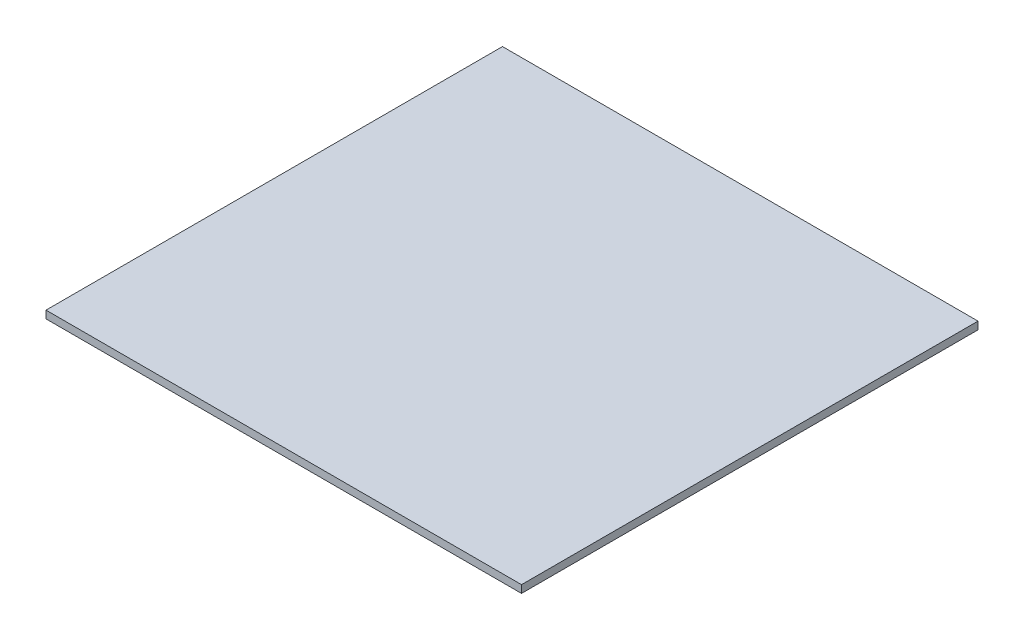
ISO-10303-21;
HEADER;
FILE_DESCRIPTION(('STEP AP214'),'2;1');
FILE_NAME('part.step','',(''),(''),'','','');
FILE_SCHEMA(('AUTOMOTIVE_DESIGN { 1 0 10303 214 1 1 1 1 }'));
ENDSEC;
DATA;
#1=APPLICATION_CONTEXT('core data for automotive mechanical design processes');
#2=APPLICATION_PROTOCOL_DEFINITION('international standard','automotive_design',2000,#1);
#3=PRODUCT_CONTEXT('',#1,'mechanical');
#4=PRODUCT('Part','Part','',(#3));
#5=PRODUCT_RELATED_PRODUCT_CATEGORY('part','',(#4));
#6=PRODUCT_DEFINITION_FORMATION('','',#4);
#7=PRODUCT_DEFINITION_CONTEXT('part definition',#1,'design');
#8=PRODUCT_DEFINITION('design','',#6,#7);
#9=PRODUCT_DEFINITION_SHAPE('','',#8);
#10=(LENGTH_UNIT() NAMED_UNIT(*) SI_UNIT(.MILLI.,.METRE.));
#11=(NAMED_UNIT(*) PLANE_ANGLE_UNIT() SI_UNIT($,.RADIAN.));
#12=(NAMED_UNIT(*) SI_UNIT($,.STERADIAN.) SOLID_ANGLE_UNIT());
#13=UNCERTAINTY_MEASURE_WITH_UNIT(LENGTH_MEASURE(1.E-05),#10,'distance_accuracy_value','');
#14=(GEOMETRIC_REPRESENTATION_CONTEXT(3) GLOBAL_UNCERTAINTY_ASSIGNED_CONTEXT((#13)) GLOBAL_UNIT_ASSIGNED_CONTEXT((#10,
#11,#12)) REPRESENTATION_CONTEXT('',''));
#15=CARTESIAN_POINT('',(0.,0.,0.));
#16=DIRECTION('',(0.,0.,1.));
#17=DIRECTION('',(1.,0.,0.));
#18=AXIS2_PLACEMENT_3D('',#15,#16,#17);
#19=CARTESIAN_POINT('',(-56.25,-2.,-82.3621323529412));
#20=DIRECTION('',(-1.,0.,0.));
#21=DIRECTION('',(0.,0.,1.));
#22=AXIS2_PLACEMENT_3D('',#19,#20,#21);
#23=PLANE('',#22);
#24=DIRECTION('',(0.,0.,1.));
#25=VECTOR('',#24,1.);
#26=CARTESIAN_POINT('',(-56.25,0.,-82.3621323529412));
#27=LINE('',#26,#25);
#28=CARTESIAN_POINT('',(-56.25,0.,-82.3621323529412));
#29=VERTEX_POINT('',#28);
#30=CARTESIAN_POINT('',(-56.25,0.,37.6378676470588));
#31=VERTEX_POINT('',#30);
#32=EDGE_CURVE('E97',#29,#31,#27,.T.);
#33=ORIENTED_EDGE('',*,*,#32,.F.);
#34=DIRECTION('',(0.,1.,0.));
#35=VECTOR('',#34,1.);
#36=CARTESIAN_POINT('',(-56.25,-2.,-82.3621323529412));
#37=LINE('',#36,#35);
#38=CARTESIAN_POINT('',(-56.25,-2.,-82.3621323529412));
#39=VERTEX_POINT('',#38);
#40=EDGE_CURVE('E11',#39,#29,#37,.T.);
#41=ORIENTED_EDGE('',*,*,#40,.F.);
#42=DIRECTION('',(0.,0.,1.));
#43=VECTOR('',#42,1.);
#44=CARTESIAN_POINT('',(-56.25,-2.,-82.3621323529412));
#45=LINE('',#44,#43);
#46=CARTESIAN_POINT('',(-56.25,-2.,37.6378676470588));
#47=VERTEX_POINT('',#46);
#48=EDGE_CURVE('E91',#39,#47,#45,.T.);
#49=ORIENTED_EDGE('',*,*,#48,.T.);
#50=DIRECTION('',(0.,1.,0.));
#51=VECTOR('',#50,1.);
#52=CARTESIAN_POINT('',(-56.25,-2.,37.6378676470588));
#53=LINE('',#52,#51);
#54=EDGE_CURVE('E36',#47,#31,#53,.T.);
#55=ORIENTED_EDGE('',*,*,#54,.T.);
#56=EDGE_LOOP('',(#33,#41,#49,#55));
#57=FACE_BOUND('',#56,.T.);
#58=ADVANCED_FACE('F33',(#57),#23,.T.);
#59=CARTESIAN_POINT('',(-56.25,-2.,-82.3621323529412));
#60=DIRECTION('',(0.,0.,-1.));
#61=DIRECTION('',(-1.,0.,0.));
#62=AXIS2_PLACEMENT_3D('',#59,#60,#61);
#63=PLANE('',#62);
#64=DIRECTION('',(-1.,0.,0.));
#65=VECTOR('',#64,1.);
#66=CARTESIAN_POINT('',(-56.25,0.,-82.3621323529412));
#67=LINE('',#66,#65);
#68=CARTESIAN_POINT('',(68.75,0.,-82.3621323529412));
#69=VERTEX_POINT('',#68);
#70=EDGE_CURVE('E93',#69,#29,#67,.T.);
#71=ORIENTED_EDGE('',*,*,#70,.F.);
#72=DIRECTION('',(0.,1.,0.));
#73=VECTOR('',#72,1.);
#74=CARTESIAN_POINT('',(68.75,-2.,-82.3621323529412));
#75=LINE('',#74,#73);
#76=CARTESIAN_POINT('',(68.75,-2.,-82.3621323529412));
#77=VERTEX_POINT('',#76);
#78=EDGE_CURVE('E42',#77,#69,#75,.T.);
#79=ORIENTED_EDGE('',*,*,#78,.F.);
#80=DIRECTION('',(-1.,0.,0.));
#81=VECTOR('',#80,1.);
#82=CARTESIAN_POINT('',(-56.25,-2.,-82.3621323529412));
#83=LINE('',#82,#81);
#84=EDGE_CURVE('E88',#77,#39,#83,.T.);
#85=ORIENTED_EDGE('',*,*,#84,.T.);
#86=ORIENTED_EDGE('',*,*,#40,.T.);
#87=EDGE_LOOP('',(#71,#79,#85,#86));
#88=FACE_BOUND('',#87,.T.);
#89=ADVANCED_FACE('F107',(#88),#63,.T.);
#90=CARTESIAN_POINT('',(68.75,-2.,-82.3621323529412));
#91=DIRECTION('',(1.,0.,0.));
#92=DIRECTION('',(0.,0.,-1.));
#93=AXIS2_PLACEMENT_3D('',#90,#91,#92);
#94=PLANE('',#93);
#95=DIRECTION('',(0.,0.,-1.));
#96=VECTOR('',#95,1.);
#97=CARTESIAN_POINT('',(68.75,0.,-82.3621323529412));
#98=LINE('',#97,#96);
#99=CARTESIAN_POINT('',(68.75,0.,37.6378676470588));
#100=VERTEX_POINT('',#99);
#101=EDGE_CURVE('E83',#100,#69,#98,.T.);
#102=ORIENTED_EDGE('',*,*,#101,.F.);
#103=DIRECTION('',(0.,1.,0.));
#104=VECTOR('',#103,1.);
#105=CARTESIAN_POINT('',(68.75,-2.,37.6378676470588));
#106=LINE('',#105,#104);
#107=CARTESIAN_POINT('',(68.75,-2.,37.6378676470588));
#108=VERTEX_POINT('',#107);
#109=EDGE_CURVE('E78',#108,#100,#106,.T.);
#110=ORIENTED_EDGE('',*,*,#109,.F.);
#111=DIRECTION('',(0.,0.,-1.));
#112=VECTOR('',#111,1.);
#113=CARTESIAN_POINT('',(68.75,-2.,-82.3621323529412));
#114=LINE('',#113,#112);
#115=EDGE_CURVE('E81',#108,#77,#114,.T.);
#116=ORIENTED_EDGE('',*,*,#115,.T.);
#117=ORIENTED_EDGE('',*,*,#78,.T.);
#118=EDGE_LOOP('',(#102,#110,#116,#117));
#119=FACE_BOUND('',#118,.T.);
#120=ADVANCED_FACE('F80',(#119),#94,.T.);
#121=CARTESIAN_POINT('',(-56.25,-2.,37.6378676470588));
#122=DIRECTION('',(0.,0.,1.));
#123=DIRECTION('',(1.,0.,0.));
#124=AXIS2_PLACEMENT_3D('',#121,#122,#123);
#125=PLANE('',#124);
#126=DIRECTION('',(1.,0.,0.));
#127=VECTOR('',#126,1.);
#128=CARTESIAN_POINT('',(-56.25,0.,37.6378676470588));
#129=LINE('',#128,#127);
#130=EDGE_CURVE('E100',#31,#100,#129,.T.);
#131=ORIENTED_EDGE('',*,*,#130,.F.);
#132=ORIENTED_EDGE('',*,*,#54,.F.);
#133=DIRECTION('',(1.,0.,0.));
#134=VECTOR('',#133,1.);
#135=CARTESIAN_POINT('',(-56.25,-2.,37.6378676470588));
#136=LINE('',#135,#134);
#137=EDGE_CURVE('E87',#47,#108,#136,.T.);
#138=ORIENTED_EDGE('',*,*,#137,.T.);
#139=ORIENTED_EDGE('',*,*,#109,.T.);
#140=EDGE_LOOP('',(#131,#132,#138,#139));
#141=FACE_BOUND('',#140,.T.);
#142=ADVANCED_FACE('F90',(#141),#125,.T.);
#143=CARTESIAN_POINT('',(0.,-2.,0.));
#144=DIRECTION('',(0.,1.,0.));
#145=DIRECTION('',(0.,0.,1.));
#146=AXIS2_PLACEMENT_3D('',#143,#144,#145);
#147=PLANE('',#146);
#148=ORIENTED_EDGE('',*,*,#48,.F.);
#149=ORIENTED_EDGE('',*,*,#84,.F.);
#150=ORIENTED_EDGE('',*,*,#115,.F.);
#151=ORIENTED_EDGE('',*,*,#137,.F.);
#152=EDGE_LOOP('',(#148,#149,#150,#151));
#153=FACE_BOUND('',#152,.T.);
#154=ADVANCED_FACE('F86',(#153),#147,.F.);
#155=CARTESIAN_POINT('',(0.,0.,0.));
#156=DIRECTION('',(0.,1.,0.));
#157=DIRECTION('',(0.,0.,1.));
#158=AXIS2_PLACEMENT_3D('',#155,#156,#157);
#159=PLANE('',#158);
#160=ORIENTED_EDGE('',*,*,#32,.T.);
#161=ORIENTED_EDGE('',*,*,#130,.T.);
#162=ORIENTED_EDGE('',*,*,#101,.T.);
#163=ORIENTED_EDGE('',*,*,#70,.T.);
#164=EDGE_LOOP('',(#160,#161,#162,#163));
#165=FACE_BOUND('',#164,.T.);
#166=ADVANCED_FACE('F106',(#165),#159,.T.);
#167=CLOSED_SHELL('',(#58,#89,#120,#142,#154,#166));
#168=MANIFOLD_SOLID_BREP('B2',#167);
#169=ADVANCED_BREP_SHAPE_REPRESENTATION('',(#18,#168),#14);
#170=SHAPE_DEFINITION_REPRESENTATION(#9,#169);
ENDSEC;
END-ISO-10303-21;
